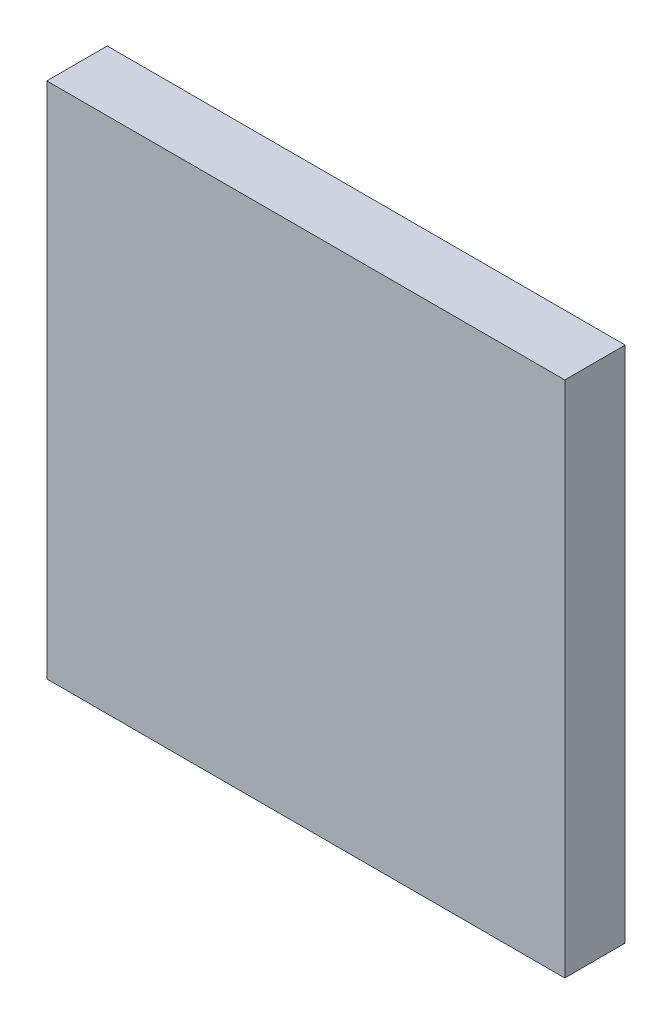
ISO-10303-21;
HEADER;
FILE_DESCRIPTION(('STEP AP214'),'2;1');
FILE_NAME('part.step','',(''),(''),'','','');
FILE_SCHEMA(('AUTOMOTIVE_DESIGN { 1 0 10303 214 1 1 1 1 }'));
ENDSEC;
DATA;
#1=APPLICATION_CONTEXT('core data for automotive mechanical design processes');
#2=APPLICATION_PROTOCOL_DEFINITION('international standard','automotive_design',2000,#1);
#3=PRODUCT_CONTEXT('',#1,'mechanical');
#4=PRODUCT('Part','Part','',(#3));
#5=PRODUCT_RELATED_PRODUCT_CATEGORY('part','',(#4));
#6=PRODUCT_DEFINITION_FORMATION('','',#4);
#7=PRODUCT_DEFINITION_CONTEXT('part definition',#1,'design');
#8=PRODUCT_DEFINITION('design','',#6,#7);
#9=PRODUCT_DEFINITION_SHAPE('','',#8);
#10=(LENGTH_UNIT() NAMED_UNIT(*) SI_UNIT(.MILLI.,.METRE.));
#11=(NAMED_UNIT(*) PLANE_ANGLE_UNIT() SI_UNIT($,.RADIAN.));
#12=(NAMED_UNIT(*) SI_UNIT($,.STERADIAN.) SOLID_ANGLE_UNIT());
#13=UNCERTAINTY_MEASURE_WITH_UNIT(LENGTH_MEASURE(1.E-05),#10,'distance_accuracy_value','');
#14=(GEOMETRIC_REPRESENTATION_CONTEXT(3) GLOBAL_UNCERTAINTY_ASSIGNED_CONTEXT((#13)) GLOBAL_UNIT_ASSIGNED_CONTEXT((#10,
#11,#12)) REPRESENTATION_CONTEXT('',''));
#15=CARTESIAN_POINT('',(0.,0.,0.));
#16=DIRECTION('',(0.,0.,1.));
#17=DIRECTION('',(1.,0.,0.));
#18=AXIS2_PLACEMENT_3D('',#15,#16,#17);
#19=CARTESIAN_POINT('',(-5.99999999999999,-6.00000000000001,1.4));
#20=DIRECTION('',(1.,0.,0.));
#21=DIRECTION('',(0.,0.,-1.));
#22=AXIS2_PLACEMENT_3D('',#19,#20,#21);
#23=PLANE('',#22);
#24=DIRECTION('',(0.,-1.,0.));
#25=VECTOR('',#24,1.);
#26=CARTESIAN_POINT('',(-5.99999999999999,-6.00000000000001,0.));
#27=LINE('',#26,#25);
#28=CARTESIAN_POINT('',(-5.99999999999999,5.99999999999999,0.));
#29=VERTEX_POINT('',#28);
#30=CARTESIAN_POINT('',(-5.99999999999999,-6.00000000000001,0.));
#31=VERTEX_POINT('',#30);
#32=EDGE_CURVE('E97',#29,#31,#27,.T.);
#33=ORIENTED_EDGE('',*,*,#32,.T.);
#34=DIRECTION('',(0.,0.,-1.));
#35=VECTOR('',#34,1.);
#36=CARTESIAN_POINT('',(-5.99999999999999,-6.00000000000001,1.4));
#37=LINE('',#36,#35);
#38=CARTESIAN_POINT('',(-5.99999999999999,-6.00000000000001,1.4));
#39=VERTEX_POINT('',#38);
#40=EDGE_CURVE('E11',#39,#31,#37,.T.);
#41=ORIENTED_EDGE('',*,*,#40,.F.);
#42=DIRECTION('',(0.,-1.,0.));
#43=VECTOR('',#42,1.);
#44=CARTESIAN_POINT('',(-5.99999999999999,-6.00000000000001,1.4));
#45=LINE('',#44,#43);
#46=CARTESIAN_POINT('',(-5.99999999999999,5.99999999999999,1.4));
#47=VERTEX_POINT('',#46);
#48=EDGE_CURVE('E85',#47,#39,#45,.T.);
#49=ORIENTED_EDGE('',*,*,#48,.F.);
#50=DIRECTION('',(0.,0.,-1.));
#51=VECTOR('',#50,1.);
#52=CARTESIAN_POINT('',(-5.99999999999999,5.99999999999999,1.4));
#53=LINE('',#52,#51);
#54=EDGE_CURVE('E93',#47,#29,#53,.T.);
#55=ORIENTED_EDGE('',*,*,#54,.T.);
#56=EDGE_LOOP('',(#33,#41,#49,#55));
#57=FACE_BOUND('',#56,.T.);
#58=ADVANCED_FACE('F34',(#57),#23,.F.);
#59=CARTESIAN_POINT('',(6.00000000000001,-6.00000000000001,1.4));
#60=DIRECTION('',(0.,1.,0.));
#61=DIRECTION('',(-1.,0.,0.));
#62=AXIS2_PLACEMENT_3D('',#59,#60,#61);
#63=PLANE('',#62);
#64=DIRECTION('',(1.,0.,0.));
#65=VECTOR('',#64,1.);
#66=CARTESIAN_POINT('',(6.00000000000001,-6.00000000000001,0.));
#67=LINE('',#66,#65);
#68=CARTESIAN_POINT('',(6.00000000000001,-6.00000000000001,0.));
#69=VERTEX_POINT('',#68);
#70=EDGE_CURVE('E89',#31,#69,#67,.T.);
#71=ORIENTED_EDGE('',*,*,#70,.T.);
#72=DIRECTION('',(0.,0.,-1.));
#73=VECTOR('',#72,1.);
#74=CARTESIAN_POINT('',(6.00000000000001,-6.00000000000001,1.4));
#75=LINE('',#74,#73);
#76=CARTESIAN_POINT('',(6.00000000000001,-6.00000000000001,1.4));
#77=VERTEX_POINT('',#76);
#78=EDGE_CURVE('E42',#77,#69,#75,.T.);
#79=ORIENTED_EDGE('',*,*,#78,.F.);
#80=DIRECTION('',(1.,0.,0.));
#81=VECTOR('',#80,1.);
#82=CARTESIAN_POINT('',(6.00000000000001,-6.00000000000001,1.4));
#83=LINE('',#82,#81);
#84=EDGE_CURVE('E80',#39,#77,#83,.T.);
#85=ORIENTED_EDGE('',*,*,#84,.F.);
#86=ORIENTED_EDGE('',*,*,#40,.T.);
#87=EDGE_LOOP('',(#71,#79,#85,#86));
#88=FACE_BOUND('',#87,.T.);
#89=ADVANCED_FACE('F88',(#88),#63,.F.);
#90=CARTESIAN_POINT('',(6.00000000000001,-6.00000000000001,1.4));
#91=DIRECTION('',(-1.,0.,0.));
#92=DIRECTION('',(0.,0.,1.));
#93=AXIS2_PLACEMENT_3D('',#90,#91,#92);
#94=PLANE('',#93);
#95=DIRECTION('',(0.,1.,0.));
#96=VECTOR('',#95,1.);
#97=CARTESIAN_POINT('',(6.00000000000001,-6.00000000000001,0.));
#98=LINE('',#97,#96);
#99=CARTESIAN_POINT('',(6.00000000000001,5.99999999999999,0.));
#100=VERTEX_POINT('',#99);
#101=EDGE_CURVE('E67',#69,#100,#98,.T.);
#102=ORIENTED_EDGE('',*,*,#101,.T.);
#103=DIRECTION('',(0.,0.,-1.));
#104=VECTOR('',#103,1.);
#105=CARTESIAN_POINT('',(6.00000000000001,5.99999999999999,1.4));
#106=LINE('',#105,#104);
#107=CARTESIAN_POINT('',(6.00000000000001,5.99999999999999,1.4));
#108=VERTEX_POINT('',#107);
#109=EDGE_CURVE('E90',#108,#100,#106,.T.);
#110=ORIENTED_EDGE('',*,*,#109,.F.);
#111=DIRECTION('',(0.,1.,0.));
#112=VECTOR('',#111,1.);
#113=CARTESIAN_POINT('',(6.00000000000001,-6.00000000000001,1.4));
#114=LINE('',#113,#112);
#115=EDGE_CURVE('E83',#77,#108,#114,.T.);
#116=ORIENTED_EDGE('',*,*,#115,.F.);
#117=ORIENTED_EDGE('',*,*,#78,.T.);
#118=EDGE_LOOP('',(#102,#110,#116,#117));
#119=FACE_BOUND('',#118,.T.);
#120=ADVANCED_FACE('F91',(#119),#94,.F.);
#121=CARTESIAN_POINT('',(6.00000000000001,5.99999999999999,1.4));
#122=DIRECTION('',(0.,-1.,0.));
#123=DIRECTION('',(0.,0.,-1.));
#124=AXIS2_PLACEMENT_3D('',#121,#122,#123);
#125=PLANE('',#124);
#126=DIRECTION('',(-1.,0.,0.));
#127=VECTOR('',#126,1.);
#128=CARTESIAN_POINT('',(6.00000000000001,5.99999999999999,0.));
#129=LINE('',#128,#127);
#130=EDGE_CURVE('E73',#100,#29,#129,.T.);
#131=ORIENTED_EDGE('',*,*,#130,.T.);
#132=ORIENTED_EDGE('',*,*,#54,.F.);
#133=DIRECTION('',(-1.,0.,0.));
#134=VECTOR('',#133,1.);
#135=CARTESIAN_POINT('',(6.00000000000001,5.99999999999999,1.4));
#136=LINE('',#135,#134);
#137=EDGE_CURVE('E50',#108,#47,#136,.T.);
#138=ORIENTED_EDGE('',*,*,#137,.F.);
#139=ORIENTED_EDGE('',*,*,#109,.T.);
#140=EDGE_LOOP('',(#131,#132,#138,#139));
#141=FACE_BOUND('',#140,.T.);
#142=ADVANCED_FACE('F104',(#141),#125,.F.);
#143=CARTESIAN_POINT('',(-5.99999999999999,5.99999999999999,1.4));
#144=DIRECTION('',(0.,0.,1.));
#145=DIRECTION('',(1.,0.,0.));
#146=AXIS2_PLACEMENT_3D('',#143,#144,#145);
#147=PLANE('',#146);
#148=ORIENTED_EDGE('',*,*,#48,.T.);
#149=ORIENTED_EDGE('',*,*,#84,.T.);
#150=ORIENTED_EDGE('',*,*,#115,.T.);
#151=ORIENTED_EDGE('',*,*,#137,.T.);
#152=EDGE_LOOP('',(#148,#149,#150,#151));
#153=FACE_BOUND('',#152,.T.);
#154=ADVANCED_FACE('F81',(#153),#147,.T.);
#155=CARTESIAN_POINT('',(-5.99999999999999,5.99999999999999,0.));
#156=DIRECTION('',(0.,0.,1.));
#157=DIRECTION('',(1.,0.,0.));
#158=AXIS2_PLACEMENT_3D('',#155,#156,#157);
#159=PLANE('',#158);
#160=ORIENTED_EDGE('',*,*,#32,.F.);
#161=ORIENTED_EDGE('',*,*,#130,.F.);
#162=ORIENTED_EDGE('',*,*,#101,.F.);
#163=ORIENTED_EDGE('',*,*,#70,.F.);
#164=EDGE_LOOP('',(#160,#161,#162,#163));
#165=FACE_BOUND('',#164,.T.);
#166=ADVANCED_FACE('F107',(#165),#159,.F.);
#167=CLOSED_SHELL('',(#58,#89,#120,#142,#154,#166));
#168=MANIFOLD_SOLID_BREP('B2',#167);
#169=ADVANCED_BREP_SHAPE_REPRESENTATION('',(#18,#168),#14);
#170=SHAPE_DEFINITION_REPRESENTATION(#9,#169);
ENDSEC;
END-ISO-10303-21;
